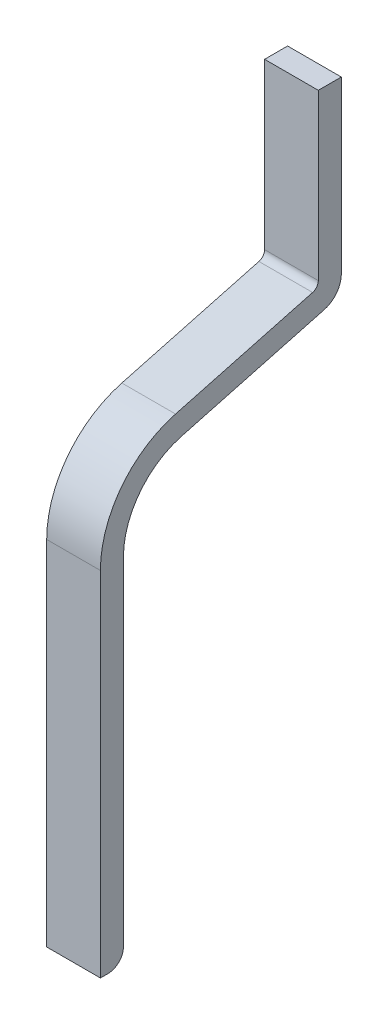
ISO-10303-21;
HEADER;
FILE_DESCRIPTION(('STEP AP214'),'2;1');
FILE_NAME('part.step','',(''),(''),'','','');
FILE_SCHEMA(('AUTOMOTIVE_DESIGN { 1 0 10303 214 1 1 1 1 }'));
ENDSEC;
DATA;
#1=APPLICATION_CONTEXT('core data for automotive mechanical design processes');
#2=APPLICATION_PROTOCOL_DEFINITION('international standard','automotive_design',2000,#1);
#3=PRODUCT_CONTEXT('',#1,'mechanical');
#4=PRODUCT('Part','Part','',(#3));
#5=PRODUCT_RELATED_PRODUCT_CATEGORY('part','',(#4));
#6=PRODUCT_DEFINITION_FORMATION('','',#4);
#7=PRODUCT_DEFINITION_CONTEXT('part definition',#1,'design');
#8=PRODUCT_DEFINITION('design','',#6,#7);
#9=PRODUCT_DEFINITION_SHAPE('','',#8);
#10=(LENGTH_UNIT() NAMED_UNIT(*) SI_UNIT(.MILLI.,.METRE.));
#11=(NAMED_UNIT(*) PLANE_ANGLE_UNIT() SI_UNIT($,.RADIAN.));
#12=(NAMED_UNIT(*) SI_UNIT($,.STERADIAN.) SOLID_ANGLE_UNIT());
#13=UNCERTAINTY_MEASURE_WITH_UNIT(LENGTH_MEASURE(1.E-05),#10,'distance_accuracy_value','');
#14=(GEOMETRIC_REPRESENTATION_CONTEXT(3) GLOBAL_UNCERTAINTY_ASSIGNED_CONTEXT((#13)) GLOBAL_UNIT_ASSIGNED_CONTEXT((#10,
#11,#12)) REPRESENTATION_CONTEXT('',''));
#15=CARTESIAN_POINT('',(0.,0.,0.));
#16=DIRECTION('',(0.,0.,1.));
#17=DIRECTION('',(1.,0.,0.));
#18=AXIS2_PLACEMENT_3D('',#15,#16,#17);
#19=CARTESIAN_POINT('',(1.115,0.71,0.789999999999986));
#20=DIRECTION('',(1.,0.,0.));
#21=DIRECTION('',(0.,1.,0.));
#22=AXIS2_PLACEMENT_3D('',#19,#20,#21);
#23=PLANE('',#22);
#24=CARTESIAN_POINT('',(1.115,1.11,0.914318767752865));
#25=DIRECTION('',(1.,0.,0.));
#26=DIRECTION('',(0.,0.965925686844594,0.258819565515824));
#27=AXIS2_PLACEMENT_3D('',#24,#25,#26);
#28=CIRCLE('',#27,0.660680205414853);
#29=CARTESIAN_POINT('',(1.115,1.74816798119997,1.08531573146324));
#30=VERTEX_POINT('',#29);
#31=CARTESIAN_POINT('',(1.115,1.11,1.57499897316772));
#32=VERTEX_POINT('',#31);
#33=EDGE_CURVE('E27',#30,#32,#28,.T.);
#34=ORIENTED_EDGE('',*,*,#33,.F.);
#35=DIRECTION('',(0.,0.258819045104547,-0.965925826288525));
#36=VECTOR('',#35,1.);
#37=CARTESIAN_POINT('',(1.115,1.74816798119997,1.08531573146324));
#38=LINE('',#37,#36);
#39=CARTESIAN_POINT('',(1.115,1.98751538823771,0.192059047744886));
#40=VERTEX_POINT('',#39);
#41=EDGE_CURVE('E234',#30,#40,#38,.T.);
#42=ORIENTED_EDGE('',*,*,#41,.T.);
#43=CARTESIAN_POINT('',(1.115,2.03581167955217,0.205));
#44=DIRECTION('',(1.,0.,0.));
#45=DIRECTION('',(0.,-0.965925826289125,-0.25881904510231));
#46=AXIS2_PLACEMENT_3D('',#43,#44,#45);
#47=CIRCLE('',#46,0.05);
#48=CARTESIAN_POINT('',(1.115,2.03581167955217,0.155));
#49=VERTEX_POINT('',#48);
#50=EDGE_CURVE('E199',#40,#49,#47,.T.);
#51=ORIENTED_EDGE('',*,*,#50,.T.);
#52=DIRECTION('',(0.,1.,0.));
#53=VECTOR('',#52,1.);
#54=CARTESIAN_POINT('',(1.115,2.61,0.155));
#55=LINE('',#54,#53);
#56=CARTESIAN_POINT('',(1.115,3.11,0.155000000000005));
#57=VERTEX_POINT('',#56);
#58=EDGE_CURVE('E180',#49,#57,#55,.T.);
#59=ORIENTED_EDGE('',*,*,#58,.T.);
#60=DIRECTION('',(0.,0.,1.));
#61=VECTOR('',#60,1.);
#62=CARTESIAN_POINT('',(1.115,3.11,0.00500000000000509));
#63=LINE('',#62,#61);
#64=CARTESIAN_POINT('',(1.115,3.11,0.00500000000000509));
#65=VERTEX_POINT('',#64);
#66=EDGE_CURVE('E178',#65,#57,#63,.T.);
#67=ORIENTED_EDGE('',*,*,#66,.F.);
#68=DIRECTION('',(0.,1.,0.));
#69=VECTOR('',#68,1.);
#70=CARTESIAN_POINT('',(1.115,1.99744533015324,0.0050000000000014));
#71=LINE('',#70,#69);
#72=CARTESIAN_POINT('',(1.115,1.99744533015324,0.0050000000000014));
#73=VERTEX_POINT('',#72);
#74=EDGE_CURVE('E213',#73,#65,#71,.T.);
#75=ORIENTED_EDGE('',*,*,#74,.F.);
#76=CARTESIAN_POINT('',(1.115,1.99744533015324,0.155));
#77=DIRECTION('',(1.,0.,0.));
#78=DIRECTION('',(0.,-0.965925826289075,-0.258819045102496));
#79=AXIS2_PLACEMENT_3D('',#76,#77,#78);
#80=CIRCLE('',#79,0.150000000000031);
#81=CARTESIAN_POINT('',(1.115,1.85255645620985,0.116177143234619));
#82=VERTEX_POINT('',#81);
#83=EDGE_CURVE('E267',#82,#73,#80,.T.);
#84=ORIENTED_EDGE('',*,*,#83,.F.);
#85=DIRECTION('',(0.,0.25881904510452,-0.965925826288533));
#86=VECTOR('',#85,1.);
#87=CARTESIAN_POINT('',(1.115,1.60327912817328,1.04649279663587));
#88=LINE('',#87,#86);
#89=CARTESIAN_POINT('',(1.115,1.60327912817328,1.04649279663587));
#90=VERTEX_POINT('',#89);
#91=EDGE_CURVE('E191',#90,#82,#88,.T.);
#92=ORIENTED_EDGE('',*,*,#91,.F.);
#93=CARTESIAN_POINT('',(1.115,1.11,0.914318767752865));
#94=DIRECTION('',(1.,0.,0.));
#95=DIRECTION('',(0.,0.965925686844594,0.258819565515824));
#96=AXIS2_PLACEMENT_3D('',#93,#94,#95);
#97=CIRCLE('',#96,0.510680205414853);
#98=CARTESIAN_POINT('',(1.115,1.11,1.42499897316772));
#99=VERTEX_POINT('',#98);
#100=EDGE_CURVE('E236',#90,#99,#97,.T.);
#101=ORIENTED_EDGE('',*,*,#100,.T.);
#102=DIRECTION('',(0.,-1.,0.));
#103=VECTOR('',#102,1.);
#104=CARTESIAN_POINT('',(1.115,1.11,1.425));
#105=LINE('',#104,#103);
#106=CARTESIAN_POINT('',(1.115,-1.09,1.425));
#107=VERTEX_POINT('',#106);
#108=EDGE_CURVE('E184',#99,#107,#105,.T.);
#109=ORIENTED_EDGE('',*,*,#108,.T.);
#110=CARTESIAN_POINT('',(1.115,-1.09,1.525));
#111=DIRECTION('',(1.,0.,0.));
#112=DIRECTION('',(0.,-1.,0.));
#113=AXIS2_PLACEMENT_3D('',#110,#111,#112);
#114=CIRCLE('',#113,0.1);
#115=CARTESIAN_POINT('',(1.115,-1.19,1.525));
#116=VERTEX_POINT('',#115);
#117=EDGE_CURVE('E164',#116,#107,#114,.T.);
#118=ORIENTED_EDGE('',*,*,#117,.F.);
#119=DIRECTION('',(0.,0.,1.));
#120=VECTOR('',#119,1.);
#121=CARTESIAN_POINT('',(1.115,-1.19,1.525));
#122=LINE('',#121,#120);
#123=CARTESIAN_POINT('',(1.115,-1.19,1.575));
#124=VERTEX_POINT('',#123);
#125=EDGE_CURVE('E157',#116,#124,#122,.T.);
#126=ORIENTED_EDGE('',*,*,#125,.T.);
#127=DIRECTION('',(0.,0.9999999999999,-4.46448818735113E-07));
#128=VECTOR('',#127,1.);
#129=CARTESIAN_POINT('',(1.115,-1.19,1.575));
#130=LINE('',#129,#128);
#131=EDGE_CURVE('E142',#124,#32,#130,.T.);
#132=ORIENTED_EDGE('',*,*,#131,.T.);
#133=EDGE_LOOP('',(#34,#42,#51,#59,#67,#75,#84,#92,#101,#109,#118,#126,#132));
#134=FACE_BOUND('',#133,.T.);
#135=ADVANCED_FACE('F17',(#134),#23,.F.);
#136=CARTESIAN_POINT('',(1.465,0.71,0.789999999999986));
#137=DIRECTION('',(1.,0.,0.));
#138=DIRECTION('',(0.,1.,0.));
#139=AXIS2_PLACEMENT_3D('',#136,#137,#138);
#140=PLANE('',#139);
#141=CARTESIAN_POINT('',(1.465,1.11,0.914318767752865));
#142=DIRECTION('',(1.,0.,0.));
#143=DIRECTION('',(0.,0.965925686844594,0.258819565515824));
#144=AXIS2_PLACEMENT_3D('',#141,#142,#143);
#145=CIRCLE('',#144,0.660680205414853);
#146=CARTESIAN_POINT('',(1.465,1.74816798119997,1.08531573146324));
#147=VERTEX_POINT('',#146);
#148=CARTESIAN_POINT('',(1.465,1.11,1.57499897316772));
#149=VERTEX_POINT('',#148);
#150=EDGE_CURVE('E11',#147,#149,#145,.T.);
#151=ORIENTED_EDGE('',*,*,#150,.T.);
#152=DIRECTION('',(0.,-0.9999999999999,4.46448818735113E-07));
#153=VECTOR('',#152,1.);
#154=CARTESIAN_POINT('',(1.465,-1.19,1.575));
#155=LINE('',#154,#153);
#156=CARTESIAN_POINT('',(1.465,-1.19,1.575));
#157=VERTEX_POINT('',#156);
#158=EDGE_CURVE('E152',#149,#157,#155,.T.);
#159=ORIENTED_EDGE('',*,*,#158,.T.);
#160=DIRECTION('',(0.,0.,-1.));
#161=VECTOR('',#160,1.);
#162=CARTESIAN_POINT('',(1.465,-1.19,1.525));
#163=LINE('',#162,#161);
#164=CARTESIAN_POINT('',(1.465,-1.19,1.525));
#165=VERTEX_POINT('',#164);
#166=EDGE_CURVE('E159',#157,#165,#163,.T.);
#167=ORIENTED_EDGE('',*,*,#166,.T.);
#168=CARTESIAN_POINT('',(1.465,-1.09,1.525));
#169=DIRECTION('',(1.,0.,0.));
#170=DIRECTION('',(0.,-1.,0.));
#171=AXIS2_PLACEMENT_3D('',#168,#169,#170);
#172=CIRCLE('',#171,0.1);
#173=CARTESIAN_POINT('',(1.465,-1.09,1.425));
#174=VERTEX_POINT('',#173);
#175=EDGE_CURVE('E174',#165,#174,#172,.T.);
#176=ORIENTED_EDGE('',*,*,#175,.T.);
#177=DIRECTION('',(0.,1.,0.));
#178=VECTOR('',#177,1.);
#179=CARTESIAN_POINT('',(1.465,1.11,1.425));
#180=LINE('',#179,#178);
#181=CARTESIAN_POINT('',(1.465,1.11,1.42499897316772));
#182=VERTEX_POINT('',#181);
#183=EDGE_CURVE('E187',#174,#182,#180,.T.);
#184=ORIENTED_EDGE('',*,*,#183,.T.);
#185=CARTESIAN_POINT('',(1.465,1.11,0.914318767752865));
#186=DIRECTION('',(-1.,0.,0.));
#187=DIRECTION('',(0.,0.965925686844594,0.258819565515824));
#188=AXIS2_PLACEMENT_3D('',#185,#186,#187);
#189=CIRCLE('',#188,0.510680205414853);
#190=CARTESIAN_POINT('',(1.465,1.60327912817328,1.04649279663587));
#191=VERTEX_POINT('',#190);
#192=EDGE_CURVE('E228',#182,#191,#189,.T.);
#193=ORIENTED_EDGE('',*,*,#192,.T.);
#194=DIRECTION('',(0.,0.25881904510452,-0.965925826288533));
#195=VECTOR('',#194,1.);
#196=CARTESIAN_POINT('',(1.465,1.60327912817328,1.04649279663587));
#197=LINE('',#196,#195);
#198=CARTESIAN_POINT('',(1.465,1.85255645620985,0.116177143234619));
#199=VERTEX_POINT('',#198);
#200=EDGE_CURVE('E21',#191,#199,#197,.T.);
#201=ORIENTED_EDGE('',*,*,#200,.T.);
#202=CARTESIAN_POINT('',(1.465,1.99744533015324,0.155));
#203=DIRECTION('',(1.,0.,0.));
#204=DIRECTION('',(0.,-0.965925826289075,-0.258819045102496));
#205=AXIS2_PLACEMENT_3D('',#202,#203,#204);
#206=CIRCLE('',#205,0.150000000000031);
#207=CARTESIAN_POINT('',(1.465,1.99744533015324,0.00500000000000139));
#208=VERTEX_POINT('',#207);
#209=EDGE_CURVE('E215',#199,#208,#206,.T.);
#210=ORIENTED_EDGE('',*,*,#209,.T.);
#211=DIRECTION('',(0.,1.,0.));
#212=VECTOR('',#211,1.);
#213=CARTESIAN_POINT('',(1.465,1.99744533015324,0.0050000000000014));
#214=LINE('',#213,#212);
#215=CARTESIAN_POINT('',(1.465,3.11,0.00500000000000509));
#216=VERTEX_POINT('',#215);
#217=EDGE_CURVE('E268',#208,#216,#214,.T.);
#218=ORIENTED_EDGE('',*,*,#217,.T.);
#219=DIRECTION('',(0.,0.,-1.));
#220=VECTOR('',#219,1.);
#221=CARTESIAN_POINT('',(1.465,3.11,0.00500000000000509));
#222=LINE('',#221,#220);
#223=CARTESIAN_POINT('',(1.465,3.11,0.155000000000005));
#224=VERTEX_POINT('',#223);
#225=EDGE_CURVE('E245',#224,#216,#222,.T.);
#226=ORIENTED_EDGE('',*,*,#225,.F.);
#227=DIRECTION('',(0.,1.,0.));
#228=VECTOR('',#227,1.);
#229=CARTESIAN_POINT('',(1.465,2.61,0.155));
#230=LINE('',#229,#228);
#231=CARTESIAN_POINT('',(1.465,2.03581167955217,0.155));
#232=VERTEX_POINT('',#231);
#233=EDGE_CURVE('E182',#232,#224,#230,.T.);
#234=ORIENTED_EDGE('',*,*,#233,.F.);
#235=CARTESIAN_POINT('',(1.465,2.03581167955217,0.205));
#236=DIRECTION('',(-1.,0.,0.));
#237=DIRECTION('',(0.,-0.965925826289125,-0.25881904510231));
#238=AXIS2_PLACEMENT_3D('',#235,#236,#237);
#239=CIRCLE('',#238,0.05);
#240=CARTESIAN_POINT('',(1.465,1.98751538823771,0.192059047744886));
#241=VERTEX_POINT('',#240);
#242=EDGE_CURVE('E196',#232,#241,#239,.T.);
#243=ORIENTED_EDGE('',*,*,#242,.T.);
#244=DIRECTION('',(0.,-0.258819045104547,0.965925826288525));
#245=VECTOR('',#244,1.);
#246=CARTESIAN_POINT('',(1.465,1.74816798119997,1.08531573146324));
#247=LINE('',#246,#245);
#248=EDGE_CURVE('E217',#241,#147,#247,.T.);
#249=ORIENTED_EDGE('',*,*,#248,.T.);
#250=EDGE_LOOP('',(#151,#159,#167,#176,#184,#193,#201,#210,#218,#226,#234,#243,#249));
#251=FACE_BOUND('',#250,.T.);
#252=ADVANCED_FACE('F283',(#251),#140,.T.);
#253=CARTESIAN_POINT('',(1.115,1.11,0.914318767752865));
#254=DIRECTION('',(1.,0.,0.));
#255=DIRECTION('',(0.,0.965925686844594,0.258819565515824));
#256=AXIS2_PLACEMENT_3D('',#253,#254,#255);
#257=CYLINDRICAL_SURFACE('',#256,0.660680205414853);
#258=ORIENTED_EDGE('',*,*,#33,.T.);
#259=DIRECTION('',(1.,0.,0.));
#260=VECTOR('',#259,1.);
#261=CARTESIAN_POINT('',(1.115,1.11,1.57499897316772));
#262=LINE('',#261,#260);
#263=EDGE_CURVE('E148',#32,#149,#262,.T.);
#264=ORIENTED_EDGE('',*,*,#263,.T.);
#265=ORIENTED_EDGE('',*,*,#150,.F.);
#266=DIRECTION('',(1.,0.,0.));
#267=VECTOR('',#266,1.);
#268=CARTESIAN_POINT('',(1.115,1.74816798119997,1.08531573146324));
#269=LINE('',#268,#267);
#270=EDGE_CURVE('E220',#30,#147,#269,.T.);
#271=ORIENTED_EDGE('',*,*,#270,.F.);
#272=EDGE_LOOP('',(#258,#264,#265,#271));
#273=FACE_BOUND('',#272,.T.);
#274=ADVANCED_FACE('F372',(#273),#257,.T.);
#275=CARTESIAN_POINT('',(1.115,1.11,1.57499897316772));
#276=DIRECTION('',(0.,4.46448818735113E-07,0.9999999999999));
#277=DIRECTION('',(1.,0.,0.));
#278=AXIS2_PLACEMENT_3D('',#275,#276,#277);
#279=PLANE('',#278);
#280=ORIENTED_EDGE('',*,*,#131,.F.);
#281=DIRECTION('',(1.,0.,0.));
#282=VECTOR('',#281,1.);
#283=CARTESIAN_POINT('',(1.115,-1.19,1.575));
#284=LINE('',#283,#282);
#285=EDGE_CURVE('E146',#124,#157,#284,.T.);
#286=ORIENTED_EDGE('',*,*,#285,.T.);
#287=ORIENTED_EDGE('',*,*,#158,.F.);
#288=ORIENTED_EDGE('',*,*,#263,.F.);
#289=EDGE_LOOP('',(#280,#286,#287,#288));
#290=FACE_BOUND('',#289,.T.);
#291=ADVANCED_FACE('F144',(#290),#279,.T.);
#292=CARTESIAN_POINT('',(1.115,-1.19,1.575));
#293=DIRECTION('',(0.,-1.,0.));
#294=DIRECTION('',(0.,0.,-1.));
#295=AXIS2_PLACEMENT_3D('',#292,#293,#294);
#296=PLANE('',#295);
#297=ORIENTED_EDGE('',*,*,#125,.F.);
#298=DIRECTION('',(1.,0.,0.));
#299=VECTOR('',#298,1.);
#300=CARTESIAN_POINT('',(1.115,-1.19,1.525));
#301=LINE('',#300,#299);
#302=EDGE_CURVE('E166',#116,#165,#301,.T.);
#303=ORIENTED_EDGE('',*,*,#302,.T.);
#304=ORIENTED_EDGE('',*,*,#166,.F.);
#305=ORIENTED_EDGE('',*,*,#285,.F.);
#306=EDGE_LOOP('',(#297,#303,#304,#305));
#307=FACE_BOUND('',#306,.T.);
#308=ADVANCED_FACE('F155',(#307),#296,.T.);
#309=CARTESIAN_POINT('',(1.115,-1.09,1.525));
#310=DIRECTION('',(1.,0.,0.));
#311=DIRECTION('',(0.,-1.,0.));
#312=AXIS2_PLACEMENT_3D('',#309,#310,#311);
#313=CYLINDRICAL_SURFACE('',#312,0.1);
#314=ORIENTED_EDGE('',*,*,#117,.T.);
#315=DIRECTION('',(1.,0.,0.));
#316=VECTOR('',#315,1.);
#317=CARTESIAN_POINT('',(1.115,-1.09,1.425));
#318=LINE('',#317,#316);
#319=EDGE_CURVE('E200',#107,#174,#318,.T.);
#320=ORIENTED_EDGE('',*,*,#319,.T.);
#321=ORIENTED_EDGE('',*,*,#175,.F.);
#322=ORIENTED_EDGE('',*,*,#302,.F.);
#323=EDGE_LOOP('',(#314,#320,#321,#322));
#324=FACE_BOUND('',#323,.T.);
#325=ADVANCED_FACE('F287',(#324),#313,.T.);
#326=CARTESIAN_POINT('',(1.115,-1.09,1.425));
#327=DIRECTION('',(0.,0.,-1.));
#328=DIRECTION('',(-1.,0.,0.));
#329=AXIS2_PLACEMENT_3D('',#326,#327,#328);
#330=PLANE('',#329);
#331=ORIENTED_EDGE('',*,*,#108,.F.);
#332=DIRECTION('',(1.,0.,0.));
#333=VECTOR('',#332,1.);
#334=CARTESIAN_POINT('',(1.115,1.11,1.42499897316772));
#335=LINE('',#334,#333);
#336=EDGE_CURVE('E188',#99,#182,#335,.T.);
#337=ORIENTED_EDGE('',*,*,#336,.T.);
#338=ORIENTED_EDGE('',*,*,#183,.F.);
#339=ORIENTED_EDGE('',*,*,#319,.F.);
#340=EDGE_LOOP('',(#331,#337,#338,#339));
#341=FACE_BOUND('',#340,.T.);
#342=ADVANCED_FACE('F289',(#341),#330,.T.);
#343=CARTESIAN_POINT('',(1.115,1.11,0.914318767752865));
#344=DIRECTION('',(1.,0.,0.));
#345=DIRECTION('',(0.,0.965925686844594,0.258819565515824));
#346=AXIS2_PLACEMENT_3D('',#343,#344,#345);
#347=CYLINDRICAL_SURFACE('',#346,0.510680205414853);
#348=ORIENTED_EDGE('',*,*,#100,.F.);
#349=DIRECTION('',(1.,0.,0.));
#350=VECTOR('',#349,1.);
#351=CARTESIAN_POINT('',(1.115,1.60327912817328,1.04649279663587));
#352=LINE('',#351,#350);
#353=EDGE_CURVE('E272',#90,#191,#352,.T.);
#354=ORIENTED_EDGE('',*,*,#353,.T.);
#355=ORIENTED_EDGE('',*,*,#192,.F.);
#356=ORIENTED_EDGE('',*,*,#336,.F.);
#357=EDGE_LOOP('',(#348,#354,#355,#356));
#358=FACE_BOUND('',#357,.T.);
#359=ADVANCED_FACE('F331',(#358),#347,.F.);
#360=CARTESIAN_POINT('',(1.115,1.60327912817328,1.04649279663587));
#361=DIRECTION('',(0.,-0.965925826288533,-0.25881904510452));
#362=DIRECTION('',(0.,0.25881904510452,-0.965925826288533));
#363=AXIS2_PLACEMENT_3D('',#360,#361,#362);
#364=PLANE('',#363);
#365=ORIENTED_EDGE('',*,*,#91,.T.);
#366=DIRECTION('',(1.,0.,0.));
#367=VECTOR('',#366,1.);
#368=CARTESIAN_POINT('',(1.115,1.85255645620985,0.116177143234619));
#369=LINE('',#368,#367);
#370=EDGE_CURVE('E195',#82,#199,#369,.T.);
#371=ORIENTED_EDGE('',*,*,#370,.T.);
#372=ORIENTED_EDGE('',*,*,#200,.F.);
#373=ORIENTED_EDGE('',*,*,#353,.F.);
#374=EDGE_LOOP('',(#365,#371,#372,#373));
#375=FACE_BOUND('',#374,.T.);
#376=ADVANCED_FACE('F328',(#375),#364,.T.);
#377=CARTESIAN_POINT('',(1.115,1.99744533015324,0.155));
#378=DIRECTION('',(1.,0.,0.));
#379=DIRECTION('',(0.,-0.965925826289075,-0.258819045102496));
#380=AXIS2_PLACEMENT_3D('',#377,#378,#379);
#381=CYLINDRICAL_SURFACE('',#380,0.150000000000031);
#382=ORIENTED_EDGE('',*,*,#83,.T.);
#383=DIRECTION('',(1.,0.,0.));
#384=VECTOR('',#383,1.);
#385=CARTESIAN_POINT('',(1.115,1.99744533015324,0.0050000000000014));
#386=LINE('',#385,#384);
#387=EDGE_CURVE('E263',#73,#208,#386,.T.);
#388=ORIENTED_EDGE('',*,*,#387,.T.);
#389=ORIENTED_EDGE('',*,*,#209,.F.);
#390=ORIENTED_EDGE('',*,*,#370,.F.);
#391=EDGE_LOOP('',(#382,#388,#389,#390));
#392=FACE_BOUND('',#391,.T.);
#393=ADVANCED_FACE('F321',(#392),#381,.T.);
#394=CARTESIAN_POINT('',(1.115,1.99744533015324,0.0050000000000014));
#395=DIRECTION('',(0.,0.,-1.));
#396=DIRECTION('',(0.,-1.,0.));
#397=AXIS2_PLACEMENT_3D('',#394,#395,#396);
#398=PLANE('',#397);
#399=ORIENTED_EDGE('',*,*,#74,.T.);
#400=DIRECTION('',(-1.,0.,0.));
#401=VECTOR('',#400,1.);
#402=CARTESIAN_POINT('',(1.115,3.11,0.00500000000000509));
#403=LINE('',#402,#401);
#404=EDGE_CURVE('E239',#216,#65,#403,.T.);
#405=ORIENTED_EDGE('',*,*,#404,.F.);
#406=ORIENTED_EDGE('',*,*,#217,.F.);
#407=ORIENTED_EDGE('',*,*,#387,.F.);
#408=EDGE_LOOP('',(#399,#405,#406,#407));
#409=FACE_BOUND('',#408,.T.);
#410=ADVANCED_FACE('F19',(#409),#398,.T.);
#411=CARTESIAN_POINT('',(1.115,2.61,0.155));
#412=DIRECTION('',(0.,0.,1.));
#413=DIRECTION('',(0.,-1.,0.));
#414=AXIS2_PLACEMENT_3D('',#411,#412,#413);
#415=PLANE('',#414);
#416=ORIENTED_EDGE('',*,*,#58,.F.);
#417=DIRECTION('',(1.,0.,0.));
#418=VECTOR('',#417,1.);
#419=CARTESIAN_POINT('',(1.115,2.03581167955217,0.155));
#420=LINE('',#419,#418);
#421=EDGE_CURVE('E183',#49,#232,#420,.T.);
#422=ORIENTED_EDGE('',*,*,#421,.T.);
#423=ORIENTED_EDGE('',*,*,#233,.T.);
#424=DIRECTION('',(1.,0.,0.));
#425=VECTOR('',#424,1.);
#426=CARTESIAN_POINT('',(1.115,3.11,0.155000000000005));
#427=LINE('',#426,#425);
#428=EDGE_CURVE('E255',#57,#224,#427,.T.);
#429=ORIENTED_EDGE('',*,*,#428,.F.);
#430=EDGE_LOOP('',(#416,#422,#423,#429));
#431=FACE_BOUND('',#430,.T.);
#432=ADVANCED_FACE('F309',(#431),#415,.T.);
#433=CARTESIAN_POINT('',(1.115,2.03581167955217,0.205));
#434=DIRECTION('',(1.,0.,0.));
#435=DIRECTION('',(0.,-0.965925826289125,-0.25881904510231));
#436=AXIS2_PLACEMENT_3D('',#433,#434,#435);
#437=CYLINDRICAL_SURFACE('',#436,0.05);
#438=ORIENTED_EDGE('',*,*,#50,.F.);
#439=DIRECTION('',(1.,0.,0.));
#440=VECTOR('',#439,1.);
#441=CARTESIAN_POINT('',(1.115,1.98751538823771,0.192059047744886));
#442=LINE('',#441,#440);
#443=EDGE_CURVE('E219',#40,#241,#442,.T.);
#444=ORIENTED_EDGE('',*,*,#443,.T.);
#445=ORIENTED_EDGE('',*,*,#242,.F.);
#446=ORIENTED_EDGE('',*,*,#421,.F.);
#447=EDGE_LOOP('',(#438,#444,#445,#446));
#448=FACE_BOUND('',#447,.T.);
#449=ADVANCED_FACE('F355',(#448),#437,.F.);
#450=CARTESIAN_POINT('',(1.115,1.98751538823799,0.192059047744961));
#451=DIRECTION('',(0.,0.965925826288525,0.258819045104547));
#452=DIRECTION('',(1.,0.,0.));
#453=AXIS2_PLACEMENT_3D('',#450,#451,#452);
#454=PLANE('',#453);
#455=ORIENTED_EDGE('',*,*,#41,.F.);
#456=ORIENTED_EDGE('',*,*,#270,.T.);
#457=ORIENTED_EDGE('',*,*,#248,.F.);
#458=ORIENTED_EDGE('',*,*,#443,.F.);
#459=EDGE_LOOP('',(#455,#456,#457,#458));
#460=FACE_BOUND('',#459,.T.);
#461=ADVANCED_FACE('F360',(#460),#454,.T.);
#462=CARTESIAN_POINT('',(1.115,3.11,0.00500000000000509));
#463=DIRECTION('',(0.,1.,0.));
#464=DIRECTION('',(0.,0.,-1.));
#465=AXIS2_PLACEMENT_3D('',#462,#463,#464);
#466=PLANE('',#465);
#467=ORIENTED_EDGE('',*,*,#66,.T.);
#468=ORIENTED_EDGE('',*,*,#428,.T.);
#469=ORIENTED_EDGE('',*,*,#225,.T.);
#470=ORIENTED_EDGE('',*,*,#404,.T.);
#471=EDGE_LOOP('',(#467,#468,#469,#470));
#472=FACE_BOUND('',#471,.T.);
#473=ADVANCED_FACE('F304',(#472),#466,.T.);
#474=CLOSED_SHELL('',(#135,#252,#274,#291,#308,#325,#342,#359,#376,#393,#410,#432,#449,#461,#473));
#475=MANIFOLD_SOLID_BREP('B1',#474);
#476=ADVANCED_BREP_SHAPE_REPRESENTATION('',(#18,#475),#14);
#477=SHAPE_DEFINITION_REPRESENTATION(#9,#476);
ENDSEC;
END-ISO-10303-21;
